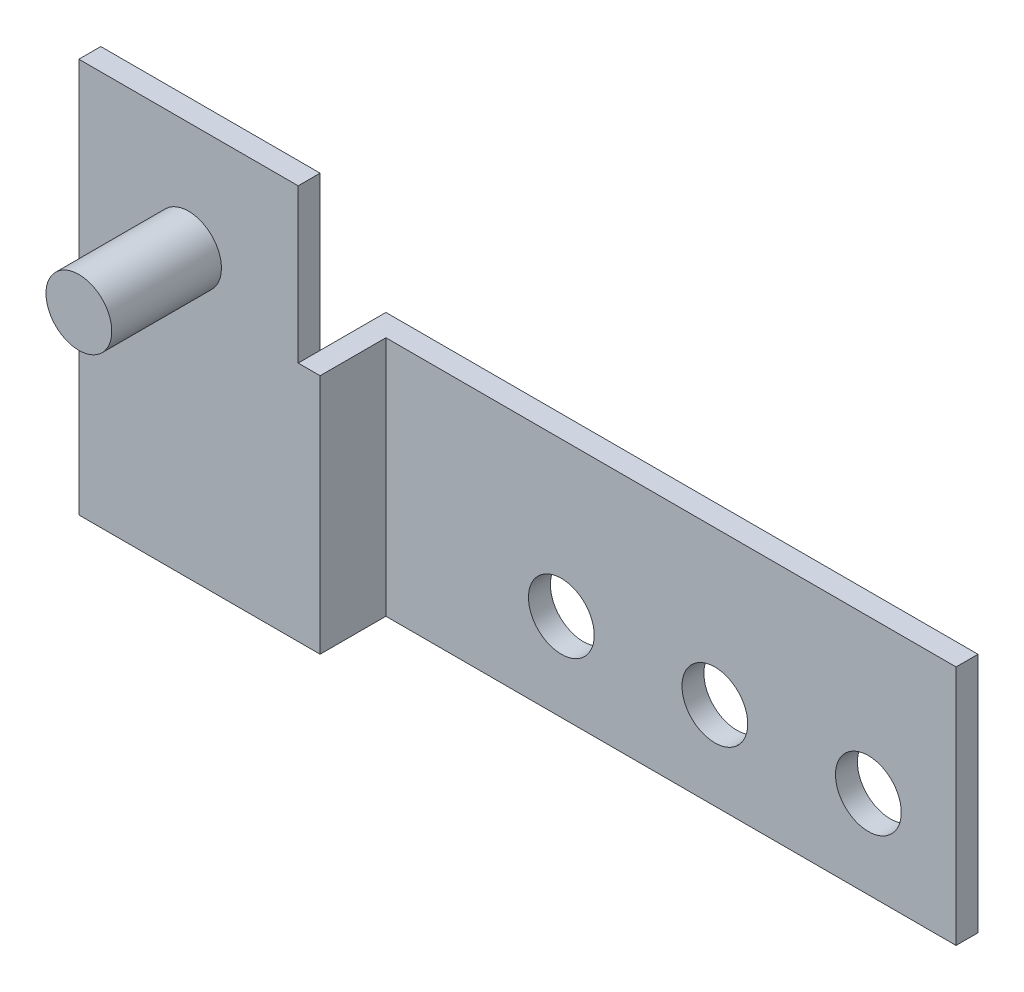
ISO-10303-21;
HEADER;
FILE_DESCRIPTION(('STEP AP214'),'2;1');
FILE_NAME('part.step','',(''),(''),'','','');
FILE_SCHEMA(('AUTOMOTIVE_DESIGN { 1 0 10303 214 1 1 1 1 }'));
ENDSEC;
DATA;
#1=APPLICATION_CONTEXT('core data for automotive mechanical design processes');
#2=APPLICATION_PROTOCOL_DEFINITION('international standard','automotive_design',2000,#1);
#3=PRODUCT_CONTEXT('',#1,'mechanical');
#4=PRODUCT('Part','Part','',(#3));
#5=PRODUCT_RELATED_PRODUCT_CATEGORY('part','',(#4));
#6=PRODUCT_DEFINITION_FORMATION('','',#4);
#7=PRODUCT_DEFINITION_CONTEXT('part definition',#1,'design');
#8=PRODUCT_DEFINITION('design','',#6,#7);
#9=PRODUCT_DEFINITION_SHAPE('','',#8);
#10=(LENGTH_UNIT() NAMED_UNIT(*) SI_UNIT(.MILLI.,.METRE.));
#11=(NAMED_UNIT(*) PLANE_ANGLE_UNIT() SI_UNIT($,.RADIAN.));
#12=(NAMED_UNIT(*) SI_UNIT($,.STERADIAN.) SOLID_ANGLE_UNIT());
#13=UNCERTAINTY_MEASURE_WITH_UNIT(LENGTH_MEASURE(1.E-05),#10,'distance_accuracy_value','');
#14=(GEOMETRIC_REPRESENTATION_CONTEXT(3) GLOBAL_UNCERTAINTY_ASSIGNED_CONTEXT((#13)) GLOBAL_UNIT_ASSIGNED_CONTEXT((#10,
#11,#12)) REPRESENTATION_CONTEXT('',''));
#15=CARTESIAN_POINT('',(0.,0.,0.));
#16=DIRECTION('',(0.,0.,1.));
#17=DIRECTION('',(1.,0.,0.));
#18=AXIS2_PLACEMENT_3D('',#15,#16,#17);
#19=CARTESIAN_POINT('',(-10.,0.,4.00000000000001));
#20=DIRECTION('',(-1.,0.,0.));
#21=DIRECTION('',(0.,0.,1.));
#22=AXIS2_PLACEMENT_3D('',#19,#20,#21);
#23=PLANE('',#22);
#24=DIRECTION('',(0.,1.,0.));
#25=VECTOR('',#24,1.);
#26=CARTESIAN_POINT('',(-10.,0.,3.));
#27=LINE('',#26,#25);
#28=CARTESIAN_POINT('',(-10.,0.,3.));
#29=VERTEX_POINT('',#28);
#30=CARTESIAN_POINT('',(-10.,18.,3.00000000000001));
#31=VERTEX_POINT('',#30);
#32=EDGE_CURVE('E138',#29,#31,#27,.T.);
#33=ORIENTED_EDGE('',*,*,#32,.F.);
#34=DIRECTION('',(0.,0.,-1.));
#35=VECTOR('',#34,1.);
#36=CARTESIAN_POINT('',(-10.,0.,4.00000000000001));
#37=LINE('',#36,#35);
#38=CARTESIAN_POINT('',(-10.,0.,4.00000000000001));
#39=VERTEX_POINT('',#38);
#40=EDGE_CURVE('E148',#39,#29,#37,.T.);
#41=ORIENTED_EDGE('',*,*,#40,.F.);
#42=DIRECTION('',(0.,1.,0.));
#43=VECTOR('',#42,1.);
#44=CARTESIAN_POINT('',(-10.,0.,4.00000000000001));
#45=LINE('',#44,#43);
#46=CARTESIAN_POINT('',(-10.,18.,4.00000000000002));
#47=VERTEX_POINT('',#46);
#48=EDGE_CURVE('E128',#39,#47,#45,.T.);
#49=ORIENTED_EDGE('',*,*,#48,.T.);
#50=DIRECTION('',(0.,0.,-1.));
#51=VECTOR('',#50,1.);
#52=CARTESIAN_POINT('',(-10.,18.,4.00000000000002));
#53=LINE('',#52,#51);
#54=EDGE_CURVE('E129',#47,#31,#53,.T.);
#55=ORIENTED_EDGE('',*,*,#54,.T.);
#56=EDGE_LOOP('',(#33,#41,#49,#55));
#57=FACE_BOUND('',#56,.T.);
#58=ADVANCED_FACE('F33',(#57),#23,.T.);
#59=CARTESIAN_POINT('',(27.,0.,4.00000000000001));
#60=DIRECTION('',(0.,-1.,0.));
#61=DIRECTION('',(0.,0.,-1.));
#62=AXIS2_PLACEMENT_3D('',#59,#60,#61);
#63=PLANE('',#62);
#64=DIRECTION('',(1.,0.,0.));
#65=VECTOR('',#64,1.);
#66=CARTESIAN_POINT('',(1.,0.,1.));
#67=LINE('',#66,#65);
#68=CARTESIAN_POINT('',(1.,0.,1.));
#69=VERTEX_POINT('',#68);
#70=CARTESIAN_POINT('',(27.,0.,1.));
#71=VERTEX_POINT('',#70);
#72=EDGE_CURVE('E114',#69,#71,#67,.T.);
#73=ORIENTED_EDGE('',*,*,#72,.F.);
#74=DIRECTION('',(0.,0.,-1.));
#75=VECTOR('',#74,1.);
#76=CARTESIAN_POINT('',(1.,0.,4.));
#77=LINE('',#76,#75);
#78=CARTESIAN_POINT('',(1.,0.,4.));
#79=VERTEX_POINT('',#78);
#80=EDGE_CURVE('E107',#79,#69,#77,.T.);
#81=ORIENTED_EDGE('',*,*,#80,.F.);
#82=DIRECTION('',(-1.,0.,0.));
#83=VECTOR('',#82,1.);
#84=CARTESIAN_POINT('',(27.,0.,4.00000000000001));
#85=LINE('',#84,#83);
#86=EDGE_CURVE('E119',#79,#39,#85,.T.);
#87=ORIENTED_EDGE('',*,*,#86,.T.);
#88=ORIENTED_EDGE('',*,*,#40,.T.);
#89=DIRECTION('',(-1.,0.,0.));
#90=VECTOR('',#89,1.);
#91=CARTESIAN_POINT('',(27.,0.,3.));
#92=LINE('',#91,#90);
#93=CARTESIAN_POINT('',(0.,0.,3.));
#94=VERTEX_POINT('',#93);
#95=EDGE_CURVE('E145',#94,#29,#92,.T.);
#96=ORIENTED_EDGE('',*,*,#95,.F.);
#97=DIRECTION('',(0.,0.,1.));
#98=VECTOR('',#97,1.);
#99=CARTESIAN_POINT('',(0.,0.,0.));
#100=LINE('',#99,#98);
#101=CARTESIAN_POINT('',(0.,0.,0.));
#102=VERTEX_POINT('',#101);
#103=EDGE_CURVE('E157',#102,#94,#100,.T.);
#104=ORIENTED_EDGE('',*,*,#103,.F.);
#105=DIRECTION('',(-1.,0.,0.));
#106=VECTOR('',#105,1.);
#107=CARTESIAN_POINT('',(0.,0.,0.));
#108=LINE('',#107,#106);
#109=CARTESIAN_POINT('',(27.,0.,0.));
#110=VERTEX_POINT('',#109);
#111=EDGE_CURVE('E176',#110,#102,#108,.T.);
#112=ORIENTED_EDGE('',*,*,#111,.F.);
#113=DIRECTION('',(0.,0.,-1.));
#114=VECTOR('',#113,1.);
#115=CARTESIAN_POINT('',(27.,0.,4.00000000000001));
#116=LINE('',#115,#114);
#117=EDGE_CURVE('E132',#71,#110,#116,.T.);
#118=ORIENTED_EDGE('',*,*,#117,.F.);
#119=EDGE_LOOP('',(#73,#81,#87,#88,#96,#104,#112,#118));
#120=FACE_BOUND('',#119,.T.);
#121=ADVANCED_FACE('F117',(#120),#63,.T.);
#122=CARTESIAN_POINT('',(27.,18.,4.00000000000002));
#123=DIRECTION('',(1.,0.,0.));
#124=DIRECTION('',(0.,0.,-1.));
#125=AXIS2_PLACEMENT_3D('',#122,#123,#124);
#126=PLANE('',#125);
#127=DIRECTION('',(0.,-1.,0.));
#128=VECTOR('',#127,1.);
#129=CARTESIAN_POINT('',(27.,18.,1.00000000000001));
#130=LINE('',#129,#128);
#131=CARTESIAN_POINT('',(27.,11.,1.00000000000001));
#132=VERTEX_POINT('',#131);
#133=EDGE_CURVE('E154',#132,#71,#130,.T.);
#134=ORIENTED_EDGE('',*,*,#133,.T.);
#135=ORIENTED_EDGE('',*,*,#117,.T.);
#136=DIRECTION('',(0.,-1.,0.));
#137=VECTOR('',#136,1.);
#138=CARTESIAN_POINT('',(27.,0.,0.));
#139=LINE('',#138,#137);
#140=CARTESIAN_POINT('',(27.,11.,0.));
#141=VERTEX_POINT('',#140);
#142=EDGE_CURVE('E171',#141,#110,#139,.T.);
#143=ORIENTED_EDGE('',*,*,#142,.F.);
#144=DIRECTION('',(0.,0.,1.));
#145=VECTOR('',#144,1.);
#146=CARTESIAN_POINT('',(27.,11.,3.));
#147=LINE('',#146,#145);
#148=EDGE_CURVE('E142',#141,#132,#147,.T.);
#149=ORIENTED_EDGE('',*,*,#148,.T.);
#150=EDGE_LOOP('',(#134,#135,#143,#149));
#151=FACE_BOUND('',#150,.T.);
#152=ADVANCED_FACE('F169',(#151),#126,.T.);
#153=CARTESIAN_POINT('',(-10.,18.,4.00000000000002));
#154=DIRECTION('',(0.,1.,0.));
#155=DIRECTION('',(0.,0.,1.));
#156=AXIS2_PLACEMENT_3D('',#153,#154,#155);
#157=PLANE('',#156);
#158=DIRECTION('',(0.,0.,1.));
#159=VECTOR('',#158,1.);
#160=CARTESIAN_POINT('',(0.,18.,3.));
#161=LINE('',#160,#159);
#162=CARTESIAN_POINT('',(0.,18.,3.));
#163=VERTEX_POINT('',#162);
#164=CARTESIAN_POINT('',(0.,18.,4.00000000000001));
#165=VERTEX_POINT('',#164);
#166=EDGE_CURVE('E190',#163,#165,#161,.T.);
#167=ORIENTED_EDGE('',*,*,#166,.F.);
#168=DIRECTION('',(1.,0.,0.));
#169=VECTOR('',#168,1.);
#170=CARTESIAN_POINT('',(-10.,18.,3.00000000000001));
#171=LINE('',#170,#169);
#172=EDGE_CURVE('E141',#31,#163,#171,.T.);
#173=ORIENTED_EDGE('',*,*,#172,.F.);
#174=ORIENTED_EDGE('',*,*,#54,.F.);
#175=DIRECTION('',(1.,0.,0.));
#176=VECTOR('',#175,1.);
#177=CARTESIAN_POINT('',(-10.,18.,4.00000000000002));
#178=LINE('',#177,#176);
#179=EDGE_CURVE('E130',#47,#165,#178,.T.);
#180=ORIENTED_EDGE('',*,*,#179,.T.);
#181=EDGE_LOOP('',(#167,#173,#174,#180));
#182=FACE_BOUND('',#181,.T.);
#183=ADVANCED_FACE('F271',(#182),#157,.T.);
#184=CARTESIAN_POINT('',(0.,0.,4.00000000000001));
#185=DIRECTION('',(0.,0.,-1.));
#186=DIRECTION('',(0.,1.,0.));
#187=AXIS2_PLACEMENT_3D('',#184,#185,#186);
#188=PLANE('',#187);
#189=CARTESIAN_POINT('',(-5.,13.,4.00000000000001));
#190=DIRECTION('',(0.,0.,-1.));
#191=DIRECTION('',(0.,1.,0.));
#192=AXIS2_PLACEMENT_3D('',#189,#190,#191);
#193=CIRCLE('',#192,1.5);
#194=CARTESIAN_POINT('',(-5.,14.5,4.00000000000001));
#195=VERTEX_POINT('',#194);
#196=EDGE_CURVE('E211',#195,#195,#193,.T.);
#197=ORIENTED_EDGE('',*,*,#196,.T.);
#198=EDGE_LOOP('',(#197));
#199=FACE_BOUND('',#198,.T.);
#200=ORIENTED_EDGE('',*,*,#86,.F.);
#201=DIRECTION('',(0.,-1.,0.));
#202=VECTOR('',#201,1.);
#203=CARTESIAN_POINT('',(0.999999999999997,18.,4.00000000000001));
#204=LINE('',#203,#202);
#205=CARTESIAN_POINT('',(0.999999999999998,11.,4.00000000000001));
#206=VERTEX_POINT('',#205);
#207=EDGE_CURVE('E104',#206,#79,#204,.T.);
#208=ORIENTED_EDGE('',*,*,#207,.F.);
#209=DIRECTION('',(1.,0.,0.));
#210=VECTOR('',#209,1.);
#211=CARTESIAN_POINT('',(0.,11.,4.00000000000001));
#212=LINE('',#211,#210);
#213=CARTESIAN_POINT('',(0.,11.,4.00000000000001));
#214=VERTEX_POINT('',#213);
#215=EDGE_CURVE('E191',#214,#206,#212,.T.);
#216=ORIENTED_EDGE('',*,*,#215,.F.);
#217=DIRECTION('',(0.,-1.,0.));
#218=VECTOR('',#217,1.);
#219=CARTESIAN_POINT('',(0.,18.,4.00000000000001));
#220=LINE('',#219,#218);
#221=EDGE_CURVE('E160',#165,#214,#220,.T.);
#222=ORIENTED_EDGE('',*,*,#221,.F.);
#223=ORIENTED_EDGE('',*,*,#179,.F.);
#224=ORIENTED_EDGE('',*,*,#48,.F.);
#225=EDGE_LOOP('',(#200,#208,#216,#222,#223,#224));
#226=FACE_BOUND('',#225,.T.);
#227=ADVANCED_FACE('F125',(#199,#226),#188,.F.);
#228=CARTESIAN_POINT('',(0.,0.,3.));
#229=DIRECTION('',(0.,0.,-1.));
#230=DIRECTION('',(0.,1.,0.));
#231=AXIS2_PLACEMENT_3D('',#228,#229,#230);
#232=PLANE('',#231);
#233=DIRECTION('',(0.,1.,0.));
#234=VECTOR('',#233,1.);
#235=CARTESIAN_POINT('',(0.,11.,3.));
#236=LINE('',#235,#234);
#237=CARTESIAN_POINT('',(0.,11.,3.));
#238=VERTEX_POINT('',#237);
#239=EDGE_CURVE('E55',#94,#238,#236,.T.);
#240=ORIENTED_EDGE('',*,*,#239,.F.);
#241=ORIENTED_EDGE('',*,*,#95,.T.);
#242=ORIENTED_EDGE('',*,*,#32,.T.);
#243=ORIENTED_EDGE('',*,*,#172,.T.);
#244=DIRECTION('',(0.,-1.,0.));
#245=VECTOR('',#244,1.);
#246=CARTESIAN_POINT('',(0.,18.,3.));
#247=LINE('',#246,#245);
#248=EDGE_CURVE('E188',#163,#238,#247,.T.);
#249=ORIENTED_EDGE('',*,*,#248,.T.);
#250=EDGE_LOOP('',(#240,#241,#242,#243,#249));
#251=FACE_BOUND('',#250,.T.);
#252=ADVANCED_FACE('F200',(#251),#232,.T.);
#253=CARTESIAN_POINT('',(0.,11.,3.));
#254=DIRECTION('',(0.,-1.,0.));
#255=DIRECTION('',(1.,0.,0.));
#256=AXIS2_PLACEMENT_3D('',#253,#254,#255);
#257=PLANE('',#256);
#258=DIRECTION('',(0.,0.,-1.));
#259=VECTOR('',#258,1.);
#260=CARTESIAN_POINT('',(0.999999999999998,11.,3.));
#261=LINE('',#260,#259);
#262=CARTESIAN_POINT('',(0.999999999999999,11.,1.));
#263=VERTEX_POINT('',#262);
#264=EDGE_CURVE('E40',#206,#263,#261,.T.);
#265=ORIENTED_EDGE('',*,*,#264,.T.);
#266=DIRECTION('',(1.,0.,0.));
#267=VECTOR('',#266,1.);
#268=CARTESIAN_POINT('',(0.,11.,1.00000000000001));
#269=LINE('',#268,#267);
#270=EDGE_CURVE('E11',#263,#132,#269,.T.);
#271=ORIENTED_EDGE('',*,*,#270,.T.);
#272=ORIENTED_EDGE('',*,*,#148,.F.);
#273=DIRECTION('',(1.,0.,0.));
#274=VECTOR('',#273,1.);
#275=CARTESIAN_POINT('',(27.,11.,0.));
#276=LINE('',#275,#274);
#277=CARTESIAN_POINT('',(0.,11.,0.));
#278=VERTEX_POINT('',#277);
#279=EDGE_CURVE('E153',#278,#141,#276,.T.);
#280=ORIENTED_EDGE('',*,*,#279,.F.);
#281=DIRECTION('',(0.,0.,1.));
#282=VECTOR('',#281,1.);
#283=CARTESIAN_POINT('',(0.,11.,0.));
#284=LINE('',#283,#282);
#285=EDGE_CURVE('E161',#278,#238,#284,.T.);
#286=ORIENTED_EDGE('',*,*,#285,.T.);
#287=DIRECTION('',(0.,0.,1.));
#288=VECTOR('',#287,1.);
#289=CARTESIAN_POINT('',(0.,11.,3.));
#290=LINE('',#289,#288);
#291=EDGE_CURVE('E196',#238,#214,#290,.T.);
#292=ORIENTED_EDGE('',*,*,#291,.T.);
#293=ORIENTED_EDGE('',*,*,#215,.T.);
#294=EDGE_LOOP('',(#265,#271,#272,#280,#286,#292,#293));
#295=FACE_BOUND('',#294,.T.);
#296=ADVANCED_FACE('F204',(#295),#257,.F.);
#297=CARTESIAN_POINT('',(0.,18.,3.));
#298=DIRECTION('',(-1.,0.,0.));
#299=DIRECTION('',(0.,0.,1.));
#300=AXIS2_PLACEMENT_3D('',#297,#298,#299);
#301=PLANE('',#300);
#302=ORIENTED_EDGE('',*,*,#221,.T.);
#303=ORIENTED_EDGE('',*,*,#291,.F.);
#304=ORIENTED_EDGE('',*,*,#248,.F.);
#305=ORIENTED_EDGE('',*,*,#166,.T.);
#306=EDGE_LOOP('',(#302,#303,#304,#305));
#307=FACE_BOUND('',#306,.T.);
#308=ADVANCED_FACE('F259',(#307),#301,.F.);
#309=CARTESIAN_POINT('',(0.,11.,0.));
#310=DIRECTION('',(1.,0.,0.));
#311=DIRECTION('',(0.,0.,-1.));
#312=AXIS2_PLACEMENT_3D('',#309,#310,#311);
#313=PLANE('',#312);
#314=ORIENTED_EDGE('',*,*,#239,.T.);
#315=ORIENTED_EDGE('',*,*,#285,.F.);
#316=DIRECTION('',(0.,1.,0.));
#317=VECTOR('',#316,1.);
#318=CARTESIAN_POINT('',(0.,11.,0.));
#319=LINE('',#318,#317);
#320=EDGE_CURVE('E181',#102,#278,#319,.T.);
#321=ORIENTED_EDGE('',*,*,#320,.F.);
#322=ORIENTED_EDGE('',*,*,#103,.T.);
#323=EDGE_LOOP('',(#314,#315,#321,#322));
#324=FACE_BOUND('',#323,.T.);
#325=ADVANCED_FACE('F202',(#324),#313,.F.);
#326=CARTESIAN_POINT('',(0.,0.,0.));
#327=DIRECTION('',(0.,0.,1.));
#328=DIRECTION('',(1.,0.,0.));
#329=AXIS2_PLACEMENT_3D('',#326,#327,#328);
#330=PLANE('',#329);
#331=CARTESIAN_POINT('',(23.,4.,0.));
#332=DIRECTION('',(0.,0.,1.));
#333=DIRECTION('',(1.,0.,0.));
#334=AXIS2_PLACEMENT_3D('',#331,#332,#333);
#335=CIRCLE('',#334,1.49999999999999);
#336=CARTESIAN_POINT('',(24.5,4.,0.));
#337=VERTEX_POINT('',#336);
#338=EDGE_CURVE('E226',#337,#337,#335,.T.);
#339=ORIENTED_EDGE('',*,*,#338,.T.);
#340=EDGE_LOOP('',(#339));
#341=FACE_BOUND('',#340,.T.);
#342=CARTESIAN_POINT('',(16.,4.,0.));
#343=DIRECTION('',(0.,0.,1.));
#344=DIRECTION('',(1.,0.,0.));
#345=AXIS2_PLACEMENT_3D('',#342,#343,#344);
#346=CIRCLE('',#345,1.49999999999999);
#347=CARTESIAN_POINT('',(17.5,4.,0.));
#348=VERTEX_POINT('',#347);
#349=EDGE_CURVE('E220',#348,#348,#346,.T.);
#350=ORIENTED_EDGE('',*,*,#349,.T.);
#351=EDGE_LOOP('',(#350));
#352=FACE_BOUND('',#351,.T.);
#353=CARTESIAN_POINT('',(9.,4.,0.));
#354=DIRECTION('',(0.,0.,1.));
#355=DIRECTION('',(1.,0.,0.));
#356=AXIS2_PLACEMENT_3D('',#353,#354,#355);
#357=CIRCLE('',#356,1.49999999999999);
#358=CARTESIAN_POINT('',(10.5,4.,0.));
#359=VERTEX_POINT('',#358);
#360=EDGE_CURVE('E214',#359,#359,#357,.T.);
#361=ORIENTED_EDGE('',*,*,#360,.T.);
#362=EDGE_LOOP('',(#361));
#363=FACE_BOUND('',#362,.T.);
#364=ORIENTED_EDGE('',*,*,#279,.T.);
#365=ORIENTED_EDGE('',*,*,#142,.T.);
#366=ORIENTED_EDGE('',*,*,#111,.T.);
#367=ORIENTED_EDGE('',*,*,#320,.T.);
#368=EDGE_LOOP('',(#364,#365,#366,#367));
#369=FACE_BOUND('',#368,.T.);
#370=ADVANCED_FACE('F175',(#341,#352,#363,#369),#330,.F.);
#371=CARTESIAN_POINT('',(0.999999999999998,18.,1.00000000000001));
#372=DIRECTION('',(0.,0.,-1.));
#373=DIRECTION('',(0.,1.,0.));
#374=AXIS2_PLACEMENT_3D('',#371,#372,#373);
#375=PLANE('',#374);
#376=CARTESIAN_POINT('',(23.,4.,1.));
#377=DIRECTION('',(0.,0.,1.));
#378=DIRECTION('',(1.,0.,0.));
#379=AXIS2_PLACEMENT_3D('',#376,#377,#378);
#380=CIRCLE('',#379,1.49999999999999);
#381=CARTESIAN_POINT('',(24.5,4.,1.));
#382=VERTEX_POINT('',#381);
#383=EDGE_CURVE('E229',#382,#382,#380,.T.);
#384=ORIENTED_EDGE('',*,*,#383,.F.);
#385=EDGE_LOOP('',(#384));
#386=FACE_BOUND('',#385,.T.);
#387=CARTESIAN_POINT('',(16.,4.,1.));
#388=DIRECTION('',(0.,0.,1.));
#389=DIRECTION('',(1.,0.,0.));
#390=AXIS2_PLACEMENT_3D('',#387,#388,#389);
#391=CIRCLE('',#390,1.49999999999999);
#392=CARTESIAN_POINT('',(17.5,4.,1.));
#393=VERTEX_POINT('',#392);
#394=EDGE_CURVE('E223',#393,#393,#391,.T.);
#395=ORIENTED_EDGE('',*,*,#394,.F.);
#396=EDGE_LOOP('',(#395));
#397=FACE_BOUND('',#396,.T.);
#398=CARTESIAN_POINT('',(9.,4.,1.));
#399=DIRECTION('',(0.,0.,1.));
#400=DIRECTION('',(1.,0.,0.));
#401=AXIS2_PLACEMENT_3D('',#398,#399,#400);
#402=CIRCLE('',#401,1.49999999999999);
#403=CARTESIAN_POINT('',(10.5,4.,1.));
#404=VERTEX_POINT('',#403);
#405=EDGE_CURVE('E217',#404,#404,#402,.T.);
#406=ORIENTED_EDGE('',*,*,#405,.F.);
#407=EDGE_LOOP('',(#406));
#408=FACE_BOUND('',#407,.T.);
#409=DIRECTION('',(0.,-1.,0.));
#410=VECTOR('',#409,1.);
#411=CARTESIAN_POINT('',(0.999999999999998,18.,1.00000000000001));
#412=LINE('',#411,#410);
#413=EDGE_CURVE('E47',#263,#69,#412,.T.);
#414=ORIENTED_EDGE('',*,*,#413,.T.);
#415=ORIENTED_EDGE('',*,*,#72,.T.);
#416=ORIENTED_EDGE('',*,*,#133,.F.);
#417=ORIENTED_EDGE('',*,*,#270,.F.);
#418=EDGE_LOOP('',(#414,#415,#416,#417));
#419=FACE_BOUND('',#418,.T.);
#420=ADVANCED_FACE('F236',(#386,#397,#408,#419),#375,.F.);
#421=CARTESIAN_POINT('',(0.999999999999997,18.,4.00000000000001));
#422=DIRECTION('',(-1.,0.,0.));
#423=DIRECTION('',(0.,0.,1.));
#424=AXIS2_PLACEMENT_3D('',#421,#422,#423);
#425=PLANE('',#424);
#426=ORIENTED_EDGE('',*,*,#207,.T.);
#427=ORIENTED_EDGE('',*,*,#80,.T.);
#428=ORIENTED_EDGE('',*,*,#413,.F.);
#429=ORIENTED_EDGE('',*,*,#264,.F.);
#430=EDGE_LOOP('',(#426,#427,#428,#429));
#431=FACE_BOUND('',#430,.T.);
#432=ADVANCED_FACE('F106',(#431),#425,.F.);
#433=CARTESIAN_POINT('',(-5.,13.,9.));
#434=DIRECTION('',(0.,0.,-1.));
#435=DIRECTION('',(0.,1.,0.));
#436=AXIS2_PLACEMENT_3D('',#433,#434,#435);
#437=CYLINDRICAL_SURFACE('',#436,1.5);
#438=CARTESIAN_POINT('',(-5.,13.,9.));
#439=DIRECTION('',(0.,0.,-1.));
#440=DIRECTION('',(0.,1.,0.));
#441=AXIS2_PLACEMENT_3D('',#438,#439,#440);
#442=CIRCLE('',#441,1.5);
#443=CARTESIAN_POINT('',(-5.,14.5,9.00000000000001));
#444=VERTEX_POINT('',#443);
#445=EDGE_CURVE('E122',#444,#444,#442,.T.);
#446=ORIENTED_EDGE('',*,*,#445,.T.);
#447=EDGE_LOOP('',(#446));
#448=FACE_BOUND('',#447,.T.);
#449=ORIENTED_EDGE('',*,*,#196,.F.);
#450=EDGE_LOOP('',(#449));
#451=FACE_BOUND('',#450,.T.);
#452=ADVANCED_FACE('F311',(#448,#451),#437,.T.);
#453=CARTESIAN_POINT('',(-3.5,13.,9.));
#454=DIRECTION('',(0.,0.,1.));
#455=DIRECTION('',(0.,-1.,0.));
#456=AXIS2_PLACEMENT_3D('',#453,#454,#455);
#457=PLANE('',#456);
#458=ORIENTED_EDGE('',*,*,#445,.F.);
#459=EDGE_LOOP('',(#458));
#460=FACE_BOUND('',#459,.T.);
#461=ADVANCED_FACE('F249',(#460),#457,.T.);
#462=CARTESIAN_POINT('',(9.,4.,1.));
#463=DIRECTION('',(0.,0.,1.));
#464=DIRECTION('',(1.,0.,0.));
#465=AXIS2_PLACEMENT_3D('',#462,#463,#464);
#466=CYLINDRICAL_SURFACE('',#465,1.49999999999999);
#467=ORIENTED_EDGE('',*,*,#405,.T.);
#468=EDGE_LOOP('',(#467));
#469=FACE_BOUND('',#468,.T.);
#470=ORIENTED_EDGE('',*,*,#360,.F.);
#471=EDGE_LOOP('',(#470));
#472=FACE_BOUND('',#471,.T.);
#473=ADVANCED_FACE('F245',(#469,#472),#466,.F.);
#474=CARTESIAN_POINT('',(16.,4.,1.));
#475=DIRECTION('',(0.,0.,1.));
#476=DIRECTION('',(1.,0.,0.));
#477=AXIS2_PLACEMENT_3D('',#474,#475,#476);
#478=CYLINDRICAL_SURFACE('',#477,1.49999999999999);
#479=ORIENTED_EDGE('',*,*,#394,.T.);
#480=EDGE_LOOP('',(#479));
#481=FACE_BOUND('',#480,.T.);
#482=ORIENTED_EDGE('',*,*,#349,.F.);
#483=EDGE_LOOP('',(#482));
#484=FACE_BOUND('',#483,.T.);
#485=ADVANCED_FACE('F248',(#481,#484),#478,.F.);
#486=CARTESIAN_POINT('',(23.,4.,1.));
#487=DIRECTION('',(0.,0.,1.));
#488=DIRECTION('',(1.,0.,0.));
#489=AXIS2_PLACEMENT_3D('',#486,#487,#488);
#490=CYLINDRICAL_SURFACE('',#489,1.49999999999999);
#491=ORIENTED_EDGE('',*,*,#383,.T.);
#492=EDGE_LOOP('',(#491));
#493=FACE_BOUND('',#492,.T.);
#494=ORIENTED_EDGE('',*,*,#338,.F.);
#495=EDGE_LOOP('',(#494));
#496=FACE_BOUND('',#495,.T.);
#497=ADVANCED_FACE('F233',(#493,#496),#490,.F.);
#498=CLOSED_SHELL('',(#58,#121,#152,#183,#227,#252,#296,#308,#325,#370,#420,#432,#452,#461,#473,
#485,#497));
#499=MANIFOLD_SOLID_BREP('B2',#498);
#500=ADVANCED_BREP_SHAPE_REPRESENTATION('',(#18,#499),#14);
#501=SHAPE_DEFINITION_REPRESENTATION(#9,#500);
ENDSEC;
END-ISO-10303-21;
